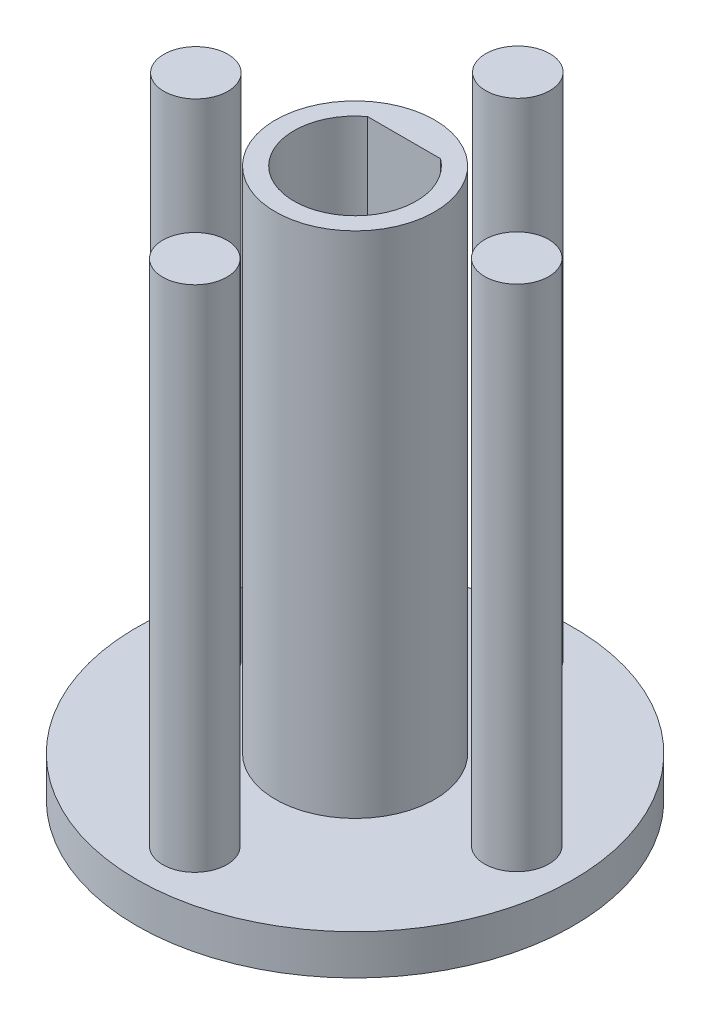
ISO-10303-21;
HEADER;
FILE_DESCRIPTION(('STEP AP214'),'2;1');
FILE_NAME('part.step','',(''),(''),'','','');
FILE_SCHEMA(('AUTOMOTIVE_DESIGN { 1 0 10303 214 1 1 1 1 }'));
ENDSEC;
DATA;
#1=APPLICATION_CONTEXT('core data for automotive mechanical design processes');
#2=APPLICATION_PROTOCOL_DEFINITION('international standard','automotive_design',2000,#1);
#3=PRODUCT_CONTEXT('',#1,'mechanical');
#4=PRODUCT('Part','Part','',(#3));
#5=PRODUCT_RELATED_PRODUCT_CATEGORY('part','',(#4));
#6=PRODUCT_DEFINITION_FORMATION('','',#4);
#7=PRODUCT_DEFINITION_CONTEXT('part definition',#1,'design');
#8=PRODUCT_DEFINITION('design','',#6,#7);
#9=PRODUCT_DEFINITION_SHAPE('','',#8);
#10=(LENGTH_UNIT() NAMED_UNIT(*) SI_UNIT(.MILLI.,.METRE.));
#11=(NAMED_UNIT(*) PLANE_ANGLE_UNIT() SI_UNIT($,.RADIAN.));
#12=(NAMED_UNIT(*) SI_UNIT($,.STERADIAN.) SOLID_ANGLE_UNIT());
#13=UNCERTAINTY_MEASURE_WITH_UNIT(LENGTH_MEASURE(1.E-05),#10,'distance_accuracy_value','');
#14=(GEOMETRIC_REPRESENTATION_CONTEXT(3) GLOBAL_UNCERTAINTY_ASSIGNED_CONTEXT((#13)) GLOBAL_UNIT_ASSIGNED_CONTEXT((#10,
#11,#12)) REPRESENTATION_CONTEXT('',''));
#15=CARTESIAN_POINT('',(0.,0.,0.));
#16=DIRECTION('',(0.,0.,1.));
#17=DIRECTION('',(1.,0.,0.));
#18=AXIS2_PLACEMENT_3D('',#15,#16,#17);
#19=CARTESIAN_POINT('',(0.,2.,0.));
#20=DIRECTION('',(0.,1.,0.));
#21=DIRECTION('',(0.,0.,1.));
#22=AXIS2_PLACEMENT_3D('',#19,#20,#21);
#23=PLANE('',#22);
#24=CARTESIAN_POINT('',(0.,2.,0.));
#25=DIRECTION('',(0.,1.,0.));
#26=DIRECTION('',(0.,0.,1.));
#27=AXIS2_PLACEMENT_3D('',#24,#25,#26);
#28=CIRCLE('',#27,10.9);
#29=CARTESIAN_POINT('',(0.,2.,10.9));
#30=VERTEX_POINT('',#29);
#31=EDGE_CURVE('E112',#30,#30,#28,.T.);
#32=ORIENTED_EDGE('',*,*,#31,.T.);
#33=EDGE_LOOP('',(#32));
#34=FACE_BOUND('',#33,.T.);
#35=CARTESIAN_POINT('',(-7.99946540436632,2.,-0.0531912101153402));
#36=DIRECTION('',(0.,1.,0.));
#37=DIRECTION('',(0.,0.,1.));
#38=AXIS2_PLACEMENT_3D('',#35,#36,#37);
#39=CIRCLE('',#38,1.6);
#40=CARTESIAN_POINT('',(-7.99946540436632,1.99999999999999,-1.65319121011534));
#41=VERTEX_POINT('',#40);
#42=EDGE_CURVE('E48',#41,#41,#39,.T.);
#43=ORIENTED_EDGE('',*,*,#42,.F.);
#44=EDGE_LOOP('',(#43));
#45=FACE_BOUND('',#44,.T.);
#46=CARTESIAN_POINT('',(0.0091799489627781,2.,8.00905715153994));
#47=DIRECTION('',(0.,1.,0.));
#48=DIRECTION('',(0.,0.,1.));
#49=AXIS2_PLACEMENT_3D('',#46,#47,#48);
#50=CIRCLE('',#49,1.6);
#51=CARTESIAN_POINT('',(0.0091799489627781,1.99999999999999,6.40905715153994));
#52=VERTEX_POINT('',#51);
#53=EDGE_CURVE('E108',#52,#52,#50,.F.);
#54=ORIENTED_EDGE('',*,*,#53,.T.);
#55=EDGE_LOOP('',(#54));
#56=FACE_BOUND('',#55,.T.);
#57=CARTESIAN_POINT('',(8.01767982733765,2.,-0.0533357152510716));
#58=DIRECTION('',(0.,1.,0.));
#59=DIRECTION('',(0.,0.,1.));
#60=AXIS2_PLACEMENT_3D('',#57,#58,#59);
#61=CIRCLE('',#60,1.6);
#62=CARTESIAN_POINT('',(8.01767982733765,1.99999999999999,-1.65333571525107));
#63=VERTEX_POINT('',#62);
#64=EDGE_CURVE('E102',#63,#63,#61,.F.);
#65=ORIENTED_EDGE('',*,*,#64,.T.);
#66=EDGE_LOOP('',(#65));
#67=FACE_BOUND('',#66,.T.);
#68=CARTESIAN_POINT('',(0.00903447400855788,2.,-8.11558407690636));
#69=DIRECTION('',(0.,1.,0.));
#70=DIRECTION('',(0.,0.,1.));
#71=AXIS2_PLACEMENT_3D('',#68,#69,#70);
#72=CIRCLE('',#71,1.6);
#73=CARTESIAN_POINT('',(0.00903447400855788,1.99999999999999,-9.71558407690635));
#74=VERTEX_POINT('',#73);
#75=EDGE_CURVE('E96',#74,#74,#72,.F.);
#76=ORIENTED_EDGE('',*,*,#75,.T.);
#77=EDGE_LOOP('',(#76));
#78=FACE_BOUND('',#77,.T.);
#79=CARTESIAN_POINT('',(0.,2.,0.));
#80=DIRECTION('',(0.,1.,0.));
#81=DIRECTION('',(0.,0.,1.));
#82=AXIS2_PLACEMENT_3D('',#79,#80,#81);
#83=CIRCLE('',#82,3.975);
#84=CARTESIAN_POINT('',(0.,1.99999999999999,-3.975));
#85=VERTEX_POINT('',#84);
#86=EDGE_CURVE('E90',#85,#85,#83,.F.);
#87=ORIENTED_EDGE('',*,*,#86,.T.);
#88=EDGE_LOOP('',(#87));
#89=FACE_BOUND('',#88,.T.);
#90=ADVANCED_FACE('F44',(#34,#45,#56,#67,#78,#89),#23,.T.);
#91=CARTESIAN_POINT('',(-7.99946540436632,27.4,-0.0531912101153402));
#92=DIRECTION('',(0.,-1.,0.));
#93=DIRECTION('',(0.,0.,-1.));
#94=AXIS2_PLACEMENT_3D('',#91,#92,#93);
#95=CYLINDRICAL_SURFACE('',#94,1.6);
#96=CARTESIAN_POINT('',(-7.99946540436632,27.4,-0.0531912101153402));
#97=DIRECTION('',(0.,1.,0.));
#98=DIRECTION('',(0.,0.,1.));
#99=AXIS2_PLACEMENT_3D('',#96,#97,#98);
#100=CIRCLE('',#99,1.6);
#101=CARTESIAN_POINT('',(-7.99946540436632,27.4,-1.65319121011534));
#102=VERTEX_POINT('',#101);
#103=EDGE_CURVE('E12',#102,#102,#100,.T.);
#104=CARTESIAN_POINT('',(-7.99946540436632,1.99999999999999,-1.65319121011534));
#105=CARTESIAN_POINT('',(-7.99946540436632,2.26458333333333,-1.65319121011534));
#106=CARTESIAN_POINT('',(-7.99946540436632,2.52916666666666,-1.65319121011534));
#107=CARTESIAN_POINT('',(-7.99946540436632,3.05833333333333,-1.65319121011534));
#108=CARTESIAN_POINT('',(-7.99946540436632,3.32291666666666,-1.65319121011534));
#109=CARTESIAN_POINT('',(-7.99946540436632,3.85208333333333,-1.65319121011534));
#110=CARTESIAN_POINT('',(-7.99946540436632,4.11666666666666,-1.65319121011534));
#111=CARTESIAN_POINT('',(-7.99946540436632,4.64583333333333,-1.65319121011534));
#112=CARTESIAN_POINT('',(-7.99946540436632,4.91041666666666,-1.65319121011534));
#113=CARTESIAN_POINT('',(-7.99946540436632,5.43958333333333,-1.65319121011534));
#114=CARTESIAN_POINT('',(-7.99946540436632,5.70416666666666,-1.65319121011534));
#115=CARTESIAN_POINT('',(-7.99946540436632,6.23333333333333,-1.65319121011534));
#116=CARTESIAN_POINT('',(-7.99946540436632,6.49791666666666,-1.65319121011534));
#117=CARTESIAN_POINT('',(-7.99946540436632,7.02708333333333,-1.65319121011534));
#118=CARTESIAN_POINT('',(-7.99946540436632,7.29166666666666,-1.65319121011534));
#119=CARTESIAN_POINT('',(-7.99946540436632,7.82083333333333,-1.65319121011534));
#120=CARTESIAN_POINT('',(-7.99946540436632,8.08541666666666,-1.65319121011534));
#121=CARTESIAN_POINT('',(-7.99946540436632,8.61458333333333,-1.65319121011534));
#122=CARTESIAN_POINT('',(-7.99946540436632,8.87916666666666,-1.65319121011534));
#123=CARTESIAN_POINT('',(-7.99946540436632,9.40833333333333,-1.65319121011534));
#124=CARTESIAN_POINT('',(-7.99946540436632,9.67291666666666,-1.65319121011534));
#125=CARTESIAN_POINT('',(-7.99946540436632,10.2020833333333,-1.65319121011534));
#126=CARTESIAN_POINT('',(-7.99946540436632,10.4666666666667,-1.65319121011534));
#127=CARTESIAN_POINT('',(-7.99946540436632,10.9958333333333,-1.65319121011534));
#128=CARTESIAN_POINT('',(-7.99946540436632,11.2604166666667,-1.65319121011534));
#129=CARTESIAN_POINT('',(-7.99946540436632,11.7895833333333,-1.65319121011534));
#130=CARTESIAN_POINT('',(-7.99946540436632,12.0541666666667,-1.65319121011534));
#131=CARTESIAN_POINT('',(-7.99946540436632,12.5833333333333,-1.65319121011534));
#132=CARTESIAN_POINT('',(-7.99946540436632,12.8479166666667,-1.65319121011534));
#133=CARTESIAN_POINT('',(-7.99946540436632,13.3770833333333,-1.65319121011534));
#134=CARTESIAN_POINT('',(-7.99946540436632,13.6416666666667,-1.65319121011534));
#135=CARTESIAN_POINT('',(-7.99946540436632,14.1708333333333,-1.65319121011534));
#136=CARTESIAN_POINT('',(-7.99946540436632,14.4354166666667,-1.65319121011534));
#137=CARTESIAN_POINT('',(-7.99946540436632,14.9645833333333,-1.65319121011534));
#138=CARTESIAN_POINT('',(-7.99946540436632,15.2291666666667,-1.65319121011534));
#139=CARTESIAN_POINT('',(-7.99946540436632,15.7583333333333,-1.65319121011534));
#140=CARTESIAN_POINT('',(-7.99946540436632,16.0229166666667,-1.65319121011534));
#141=CARTESIAN_POINT('',(-7.99946540436632,16.5520833333333,-1.65319121011534));
#142=CARTESIAN_POINT('',(-7.99946540436632,16.8166666666667,-1.65319121011534));
#143=CARTESIAN_POINT('',(-7.99946540436632,17.3458333333333,-1.65319121011534));
#144=CARTESIAN_POINT('',(-7.99946540436632,17.6104166666667,-1.65319121011534));
#145=CARTESIAN_POINT('',(-7.99946540436632,18.1395833333333,-1.65319121011534));
#146=CARTESIAN_POINT('',(-7.99946540436632,18.4041666666667,-1.65319121011534));
#147=CARTESIAN_POINT('',(-7.99946540436632,18.9333333333333,-1.65319121011534));
#148=CARTESIAN_POINT('',(-7.99946540436632,19.1979166666667,-1.65319121011534));
#149=CARTESIAN_POINT('',(-7.99946540436632,19.7270833333333,-1.65319121011534));
#150=CARTESIAN_POINT('',(-7.99946540436632,19.9916666666667,-1.65319121011534));
#151=CARTESIAN_POINT('',(-7.99946540436632,20.5208333333333,-1.65319121011534));
#152=CARTESIAN_POINT('',(-7.99946540436632,20.7854166666667,-1.65319121011534));
#153=CARTESIAN_POINT('',(-7.99946540436632,21.3145833333333,-1.65319121011534));
#154=CARTESIAN_POINT('',(-7.99946540436632,21.5791666666667,-1.65319121011534));
#155=CARTESIAN_POINT('',(-7.99946540436632,22.1083333333333,-1.65319121011534));
#156=CARTESIAN_POINT('',(-7.99946540436632,22.3729166666667,-1.65319121011534));
#157=CARTESIAN_POINT('',(-7.99946540436632,22.9020833333333,-1.65319121011534));
#158=CARTESIAN_POINT('',(-7.99946540436632,23.1666666666667,-1.65319121011534));
#159=CARTESIAN_POINT('',(-7.99946540436632,23.6958333333333,-1.65319121011534));
#160=CARTESIAN_POINT('',(-7.99946540436632,23.9604166666667,-1.65319121011534));
#161=CARTESIAN_POINT('',(-7.99946540436632,24.4895833333333,-1.65319121011534));
#162=CARTESIAN_POINT('',(-7.99946540436632,24.7541666666667,-1.65319121011534));
#163=CARTESIAN_POINT('',(-7.99946540436632,25.2833333333333,-1.65319121011534));
#164=CARTESIAN_POINT('',(-7.99946540436632,25.5479166666667,-1.65319121011534));
#165=CARTESIAN_POINT('',(-7.99946540436632,26.0770833333333,-1.65319121011534));
#166=CARTESIAN_POINT('',(-7.99946540436632,26.3416666666667,-1.65319121011534));
#167=CARTESIAN_POINT('',(-7.99946540436632,26.8708333333333,-1.65319121011534));
#168=CARTESIAN_POINT('',(-7.99946540436632,27.1354166666667,-1.65319121011534));
#169=CARTESIAN_POINT('',(-7.99946540436632,27.4,-1.65319121011534));
#170=B_SPLINE_CURVE_WITH_KNOTS('',3,(#104,#105,#106,#107,#108,#109,#110,#111,#112,#113,#114,
#115,#116,#117,#118,#119,#120,#121,#122,#123,#124,#125,#126,#127,#128,#129,#130,#131,#132,#133,
#134,#135,#136,#137,#138,#139,#140,#141,#142,#143,#144,#145,#146,#147,#148,#149,#150,#151,#152,
#153,#154,#155,#156,#157,#158,#159,#160,#161,#162,#163,#164,#165,#166,#167,#168,#169),
.UNSPECIFIED.,.F.,.F.,(4,2,2,2,2,2,2,2,2,2,2,2,2,2,2,2,2,2,2,2,2,2,2,2,2,2,2,2,2,2,2,2,4),(0.,
0.793749999999999,1.5875,2.38125,3.175,3.96875,4.7625,5.55625,6.35,7.14375,7.9375,8.73125,9.525,
10.31875,11.1125,11.90625,12.7,13.49375,14.2875,15.08125,15.875,16.66875,17.4625,18.25625,19.05,
19.84375,20.6375,21.43125,22.225,23.01875,23.8125,24.60625,25.4),.UNSPECIFIED.);
#171=EDGE_CURVE('BSEAM46',#41,#102,#170,.T.);
#172=ORIENTED_EDGE('',*,*,#42,.T.);
#173=ORIENTED_EDGE('',*,*,#103,.F.);
#174=ORIENTED_EDGE('',*,*,#171,.T.);
#175=ORIENTED_EDGE('',*,*,#171,.F.);
#176=EDGE_LOOP('',(#172,#174,#173,#175));
#177=FACE_BOUND('',#176,.T.);
#178=ADVANCED_FACE('F46',(#177),#95,.T.);
#179=CARTESIAN_POINT('',(-7.99946540436632,27.4,-0.0531912101153402));
#180=DIRECTION('',(0.,1.,0.));
#181=DIRECTION('',(0.,0.,1.));
#182=AXIS2_PLACEMENT_3D('',#179,#180,#181);
#183=PLANE('',#182);
#184=ORIENTED_EDGE('',*,*,#103,.T.);
#185=EDGE_LOOP('',(#184));
#186=FACE_BOUND('',#185,.T.);
#187=ADVANCED_FACE('F130',(#186),#183,.T.);
#188=CARTESIAN_POINT('',(0.,2.,0.));
#189=DIRECTION('',(0.,-1.,0.));
#190=DIRECTION('',(0.,0.,-1.));
#191=AXIS2_PLACEMENT_3D('',#188,#189,#190);
#192=CYLINDRICAL_SURFACE('',#191,10.9);
#193=ORIENTED_EDGE('',*,*,#31,.F.);
#194=EDGE_LOOP('',(#193));
#195=FACE_BOUND('',#194,.T.);
#196=CARTESIAN_POINT('',(0.,0.,0.));
#197=DIRECTION('',(0.,1.,0.));
#198=DIRECTION('',(0.,0.,1.));
#199=AXIS2_PLACEMENT_3D('',#196,#197,#198);
#200=CIRCLE('',#199,10.9);
#201=CARTESIAN_POINT('',(0.,0.,10.9));
#202=VERTEX_POINT('',#201);
#203=EDGE_CURVE('E111',#202,#202,#200,.T.);
#204=ORIENTED_EDGE('',*,*,#203,.T.);
#205=EDGE_LOOP('',(#204));
#206=FACE_BOUND('',#205,.T.);
#207=ADVANCED_FACE('F118',(#195,#206),#192,.T.);
#208=CARTESIAN_POINT('',(-7.99946540436632,0.,-0.0531912101153402));
#209=DIRECTION('',(0.,1.,0.));
#210=DIRECTION('',(0.,0.,1.));
#211=AXIS2_PLACEMENT_3D('',#208,#209,#210);
#212=PLANE('',#211);
#213=ORIENTED_EDGE('',*,*,#203,.F.);
#214=EDGE_LOOP('',(#213));
#215=FACE_BOUND('',#214,.T.);
#216=ADVANCED_FACE('F120',(#215),#212,.F.);
#217=CARTESIAN_POINT('',(0.0091799489627781,27.4,8.00905715153994));
#218=DIRECTION('',(0.,-1.,0.));
#219=DIRECTION('',(0.,0.,-1.));
#220=AXIS2_PLACEMENT_3D('',#217,#218,#219);
#221=CYLINDRICAL_SURFACE('',#220,1.6);
#222=CARTESIAN_POINT('',(0.0091799489627781,27.4,8.00905715153994));
#223=DIRECTION('',(0.,1.,0.));
#224=DIRECTION('',(0.,0.,1.));
#225=AXIS2_PLACEMENT_3D('',#222,#223,#224);
#226=CIRCLE('',#225,1.6);
#227=CARTESIAN_POINT('',(0.0091799489627781,27.4,6.40905715153994));
#228=VERTEX_POINT('',#227);
#229=EDGE_CURVE('E105',#228,#228,#226,.T.);
#230=CARTESIAN_POINT('',(0.0091799489627781,1.99999999999999,6.40905715153994));
#231=CARTESIAN_POINT('',(0.0091799489627781,2.26458333333333,6.40905715153994));
#232=CARTESIAN_POINT('',(0.0091799489627781,2.52916666666666,6.40905715153994));
#233=CARTESIAN_POINT('',(0.0091799489627781,3.05833333333333,6.40905715153994));
#234=CARTESIAN_POINT('',(0.0091799489627781,3.32291666666666,6.40905715153994));
#235=CARTESIAN_POINT('',(0.0091799489627781,3.85208333333333,6.40905715153994));
#236=CARTESIAN_POINT('',(0.0091799489627781,4.11666666666666,6.40905715153994));
#237=CARTESIAN_POINT('',(0.0091799489627781,4.64583333333333,6.40905715153994));
#238=CARTESIAN_POINT('',(0.0091799489627781,4.91041666666666,6.40905715153994));
#239=CARTESIAN_POINT('',(0.0091799489627781,5.43958333333333,6.40905715153994));
#240=CARTESIAN_POINT('',(0.0091799489627781,5.70416666666666,6.40905715153994));
#241=CARTESIAN_POINT('',(0.0091799489627781,6.23333333333333,6.40905715153994));
#242=CARTESIAN_POINT('',(0.0091799489627781,6.49791666666666,6.40905715153994));
#243=CARTESIAN_POINT('',(0.0091799489627781,7.02708333333333,6.40905715153994));
#244=CARTESIAN_POINT('',(0.0091799489627781,7.29166666666666,6.40905715153994));
#245=CARTESIAN_POINT('',(0.0091799489627781,7.82083333333333,6.40905715153994));
#246=CARTESIAN_POINT('',(0.0091799489627781,8.08541666666666,6.40905715153994));
#247=CARTESIAN_POINT('',(0.0091799489627781,8.61458333333333,6.40905715153994));
#248=CARTESIAN_POINT('',(0.0091799489627781,8.87916666666666,6.40905715153994));
#249=CARTESIAN_POINT('',(0.0091799489627781,9.40833333333333,6.40905715153994));
#250=CARTESIAN_POINT('',(0.0091799489627781,9.67291666666666,6.40905715153994));
#251=CARTESIAN_POINT('',(0.0091799489627781,10.2020833333333,6.40905715153994));
#252=CARTESIAN_POINT('',(0.0091799489627781,10.4666666666667,6.40905715153994));
#253=CARTESIAN_POINT('',(0.0091799489627781,10.9958333333333,6.40905715153994));
#254=CARTESIAN_POINT('',(0.0091799489627781,11.2604166666667,6.40905715153994));
#255=CARTESIAN_POINT('',(0.0091799489627781,11.7895833333333,6.40905715153994));
#256=CARTESIAN_POINT('',(0.0091799489627781,12.0541666666667,6.40905715153994));
#257=CARTESIAN_POINT('',(0.0091799489627781,12.5833333333333,6.40905715153994));
#258=CARTESIAN_POINT('',(0.0091799489627781,12.8479166666667,6.40905715153994));
#259=CARTESIAN_POINT('',(0.0091799489627781,13.3770833333333,6.40905715153994));
#260=CARTESIAN_POINT('',(0.0091799489627781,13.6416666666667,6.40905715153994));
#261=CARTESIAN_POINT('',(0.0091799489627781,14.1708333333333,6.40905715153994));
#262=CARTESIAN_POINT('',(0.0091799489627781,14.4354166666667,6.40905715153994));
#263=CARTESIAN_POINT('',(0.0091799489627781,14.9645833333333,6.40905715153994));
#264=CARTESIAN_POINT('',(0.0091799489627781,15.2291666666667,6.40905715153994));
#265=CARTESIAN_POINT('',(0.0091799489627781,15.7583333333333,6.40905715153994));
#266=CARTESIAN_POINT('',(0.0091799489627781,16.0229166666667,6.40905715153994));
#267=CARTESIAN_POINT('',(0.0091799489627781,16.5520833333333,6.40905715153994));
#268=CARTESIAN_POINT('',(0.0091799489627781,16.8166666666667,6.40905715153994));
#269=CARTESIAN_POINT('',(0.0091799489627781,17.3458333333333,6.40905715153994));
#270=CARTESIAN_POINT('',(0.0091799489627781,17.6104166666667,6.40905715153994));
#271=CARTESIAN_POINT('',(0.0091799489627781,18.1395833333333,6.40905715153994));
#272=CARTESIAN_POINT('',(0.0091799489627781,18.4041666666667,6.40905715153994));
#273=CARTESIAN_POINT('',(0.0091799489627781,18.9333333333333,6.40905715153994));
#274=CARTESIAN_POINT('',(0.0091799489627781,19.1979166666667,6.40905715153994));
#275=CARTESIAN_POINT('',(0.0091799489627781,19.7270833333333,6.40905715153994));
#276=CARTESIAN_POINT('',(0.0091799489627781,19.9916666666667,6.40905715153994));
#277=CARTESIAN_POINT('',(0.0091799489627781,20.5208333333333,6.40905715153994));
#278=CARTESIAN_POINT('',(0.0091799489627781,20.7854166666667,6.40905715153994));
#279=CARTESIAN_POINT('',(0.0091799489627781,21.3145833333333,6.40905715153994));
#280=CARTESIAN_POINT('',(0.0091799489627781,21.5791666666667,6.40905715153994));
#281=CARTESIAN_POINT('',(0.0091799489627781,22.1083333333333,6.40905715153994));
#282=CARTESIAN_POINT('',(0.0091799489627781,22.3729166666667,6.40905715153994));
#283=CARTESIAN_POINT('',(0.0091799489627781,22.9020833333333,6.40905715153994));
#284=CARTESIAN_POINT('',(0.0091799489627781,23.1666666666667,6.40905715153994));
#285=CARTESIAN_POINT('',(0.0091799489627781,23.6958333333333,6.40905715153994));
#286=CARTESIAN_POINT('',(0.0091799489627781,23.9604166666667,6.40905715153994));
#287=CARTESIAN_POINT('',(0.0091799489627781,24.4895833333333,6.40905715153994));
#288=CARTESIAN_POINT('',(0.0091799489627781,24.7541666666667,6.40905715153994));
#289=CARTESIAN_POINT('',(0.0091799489627781,25.2833333333333,6.40905715153994));
#290=CARTESIAN_POINT('',(0.0091799489627781,25.5479166666667,6.40905715153994));
#291=CARTESIAN_POINT('',(0.0091799489627781,26.0770833333333,6.40905715153994));
#292=CARTESIAN_POINT('',(0.0091799489627781,26.3416666666667,6.40905715153994));
#293=CARTESIAN_POINT('',(0.0091799489627781,26.8708333333333,6.40905715153994));
#294=CARTESIAN_POINT('',(0.0091799489627781,27.1354166666667,6.40905715153994));
#295=CARTESIAN_POINT('',(0.0091799489627781,27.4,6.40905715153994));
#296=B_SPLINE_CURVE_WITH_KNOTS('',3,(#230,#231,#232,#233,#234,#235,#236,#237,#238,#239,#240,
#241,#242,#243,#244,#245,#246,#247,#248,#249,#250,#251,#252,#253,#254,#255,#256,#257,#258,#259,
#260,#261,#262,#263,#264,#265,#266,#267,#268,#269,#270,#271,#272,#273,#274,#275,#276,#277,#278,
#279,#280,#281,#282,#283,#284,#285,#286,#287,#288,#289,#290,#291,#292,#293,#294,#295),
.UNSPECIFIED.,.F.,.F.,(4,2,2,2,2,2,2,2,2,2,2,2,2,2,2,2,2,2,2,2,2,2,2,2,2,2,2,2,2,2,2,2,4),(0.,
0.793749999999999,1.5875,2.38125,3.175,3.96875,4.7625,5.55625,6.35,7.14375,7.9375,8.73125,9.525,
10.31875,11.1125,11.90625,12.7,13.49375,14.2875,15.08125,15.875,16.66875,17.4625,18.25625,19.05,
19.84375,20.6375,21.43125,22.225,23.01875,23.8125,24.60625,25.4),.UNSPECIFIED.);
#297=EDGE_CURVE('BSEAM122',#52,#228,#296,.T.);
#298=ORIENTED_EDGE('',*,*,#53,.F.);
#299=ORIENTED_EDGE('',*,*,#229,.F.);
#300=ORIENTED_EDGE('',*,*,#297,.T.);
#301=ORIENTED_EDGE('',*,*,#297,.F.);
#302=EDGE_LOOP('',(#298,#300,#299,#301));
#303=FACE_BOUND('',#302,.T.);
#304=ADVANCED_FACE('F122',(#303),#221,.T.);
#305=CARTESIAN_POINT('',(0.0091799489627781,27.4,8.00905715153994));
#306=DIRECTION('',(0.,1.,0.));
#307=DIRECTION('',(0.,0.,1.));
#308=AXIS2_PLACEMENT_3D('',#305,#306,#307);
#309=PLANE('',#308);
#310=ORIENTED_EDGE('',*,*,#229,.T.);
#311=EDGE_LOOP('',(#310));
#312=FACE_BOUND('',#311,.T.);
#313=ADVANCED_FACE('F127',(#312),#309,.T.);
#314=CARTESIAN_POINT('',(8.01767982733765,27.4,-0.0533357152510716));
#315=DIRECTION('',(0.,-1.,0.));
#316=DIRECTION('',(0.,0.,-1.));
#317=AXIS2_PLACEMENT_3D('',#314,#315,#316);
#318=CYLINDRICAL_SURFACE('',#317,1.6);
#319=CARTESIAN_POINT('',(8.01767982733765,27.4,-0.0533357152510716));
#320=DIRECTION('',(0.,1.,0.));
#321=DIRECTION('',(0.,0.,1.));
#322=AXIS2_PLACEMENT_3D('',#319,#320,#321);
#323=CIRCLE('',#322,1.6);
#324=CARTESIAN_POINT('',(8.01767982733765,27.4,-1.65333571525107));
#325=VERTEX_POINT('',#324);
#326=EDGE_CURVE('E99',#325,#325,#323,.T.);
#327=CARTESIAN_POINT('',(8.01767982733765,1.99999999999999,-1.65333571525107));
#328=CARTESIAN_POINT('',(8.01767982733765,2.26458333333333,-1.65333571525107));
#329=CARTESIAN_POINT('',(8.01767982733765,2.52916666666666,-1.65333571525107));
#330=CARTESIAN_POINT('',(8.01767982733765,3.05833333333333,-1.65333571525107));
#331=CARTESIAN_POINT('',(8.01767982733765,3.32291666666666,-1.65333571525107));
#332=CARTESIAN_POINT('',(8.01767982733765,3.85208333333333,-1.65333571525107));
#333=CARTESIAN_POINT('',(8.01767982733765,4.11666666666666,-1.65333571525107));
#334=CARTESIAN_POINT('',(8.01767982733765,4.64583333333333,-1.65333571525107));
#335=CARTESIAN_POINT('',(8.01767982733765,4.91041666666666,-1.65333571525107));
#336=CARTESIAN_POINT('',(8.01767982733765,5.43958333333333,-1.65333571525107));
#337=CARTESIAN_POINT('',(8.01767982733765,5.70416666666666,-1.65333571525107));
#338=CARTESIAN_POINT('',(8.01767982733765,6.23333333333333,-1.65333571525107));
#339=CARTESIAN_POINT('',(8.01767982733765,6.49791666666666,-1.65333571525107));
#340=CARTESIAN_POINT('',(8.01767982733765,7.02708333333333,-1.65333571525107));
#341=CARTESIAN_POINT('',(8.01767982733765,7.29166666666666,-1.65333571525107));
#342=CARTESIAN_POINT('',(8.01767982733765,7.82083333333333,-1.65333571525107));
#343=CARTESIAN_POINT('',(8.01767982733765,8.08541666666666,-1.65333571525107));
#344=CARTESIAN_POINT('',(8.01767982733765,8.61458333333333,-1.65333571525107));
#345=CARTESIAN_POINT('',(8.01767982733765,8.87916666666666,-1.65333571525107));
#346=CARTESIAN_POINT('',(8.01767982733765,9.40833333333333,-1.65333571525107));
#347=CARTESIAN_POINT('',(8.01767982733765,9.67291666666666,-1.65333571525107));
#348=CARTESIAN_POINT('',(8.01767982733765,10.2020833333333,-1.65333571525107));
#349=CARTESIAN_POINT('',(8.01767982733765,10.4666666666667,-1.65333571525107));
#350=CARTESIAN_POINT('',(8.01767982733765,10.9958333333333,-1.65333571525107));
#351=CARTESIAN_POINT('',(8.01767982733765,11.2604166666667,-1.65333571525107));
#352=CARTESIAN_POINT('',(8.01767982733765,11.7895833333333,-1.65333571525107));
#353=CARTESIAN_POINT('',(8.01767982733765,12.0541666666667,-1.65333571525107));
#354=CARTESIAN_POINT('',(8.01767982733765,12.5833333333333,-1.65333571525107));
#355=CARTESIAN_POINT('',(8.01767982733765,12.8479166666667,-1.65333571525107));
#356=CARTESIAN_POINT('',(8.01767982733765,13.3770833333333,-1.65333571525107));
#357=CARTESIAN_POINT('',(8.01767982733765,13.6416666666667,-1.65333571525107));
#358=CARTESIAN_POINT('',(8.01767982733765,14.1708333333333,-1.65333571525107));
#359=CARTESIAN_POINT('',(8.01767982733765,14.4354166666667,-1.65333571525107));
#360=CARTESIAN_POINT('',(8.01767982733765,14.9645833333333,-1.65333571525107));
#361=CARTESIAN_POINT('',(8.01767982733765,15.2291666666667,-1.65333571525107));
#362=CARTESIAN_POINT('',(8.01767982733765,15.7583333333333,-1.65333571525107));
#363=CARTESIAN_POINT('',(8.01767982733765,16.0229166666667,-1.65333571525107));
#364=CARTESIAN_POINT('',(8.01767982733765,16.5520833333333,-1.65333571525107));
#365=CARTESIAN_POINT('',(8.01767982733765,16.8166666666667,-1.65333571525107));
#366=CARTESIAN_POINT('',(8.01767982733765,17.3458333333333,-1.65333571525107));
#367=CARTESIAN_POINT('',(8.01767982733765,17.6104166666667,-1.65333571525107));
#368=CARTESIAN_POINT('',(8.01767982733765,18.1395833333333,-1.65333571525107));
#369=CARTESIAN_POINT('',(8.01767982733765,18.4041666666667,-1.65333571525107));
#370=CARTESIAN_POINT('',(8.01767982733765,18.9333333333333,-1.65333571525107));
#371=CARTESIAN_POINT('',(8.01767982733765,19.1979166666667,-1.65333571525107));
#372=CARTESIAN_POINT('',(8.01767982733765,19.7270833333333,-1.65333571525107));
#373=CARTESIAN_POINT('',(8.01767982733765,19.9916666666667,-1.65333571525107));
#374=CARTESIAN_POINT('',(8.01767982733765,20.5208333333333,-1.65333571525107));
#375=CARTESIAN_POINT('',(8.01767982733765,20.7854166666667,-1.65333571525107));
#376=CARTESIAN_POINT('',(8.01767982733765,21.3145833333333,-1.65333571525107));
#377=CARTESIAN_POINT('',(8.01767982733765,21.5791666666667,-1.65333571525107));
#378=CARTESIAN_POINT('',(8.01767982733765,22.1083333333333,-1.65333571525107));
#379=CARTESIAN_POINT('',(8.01767982733765,22.3729166666667,-1.65333571525107));
#380=CARTESIAN_POINT('',(8.01767982733765,22.9020833333333,-1.65333571525107));
#381=CARTESIAN_POINT('',(8.01767982733765,23.1666666666667,-1.65333571525107));
#382=CARTESIAN_POINT('',(8.01767982733765,23.6958333333333,-1.65333571525107));
#383=CARTESIAN_POINT('',(8.01767982733765,23.9604166666667,-1.65333571525107));
#384=CARTESIAN_POINT('',(8.01767982733765,24.4895833333333,-1.65333571525107));
#385=CARTESIAN_POINT('',(8.01767982733765,24.7541666666667,-1.65333571525107));
#386=CARTESIAN_POINT('',(8.01767982733765,25.2833333333333,-1.65333571525107));
#387=CARTESIAN_POINT('',(8.01767982733765,25.5479166666667,-1.65333571525107));
#388=CARTESIAN_POINT('',(8.01767982733765,26.0770833333333,-1.65333571525107));
#389=CARTESIAN_POINT('',(8.01767982733765,26.3416666666667,-1.65333571525107));
#390=CARTESIAN_POINT('',(8.01767982733765,26.8708333333333,-1.65333571525107));
#391=CARTESIAN_POINT('',(8.01767982733765,27.1354166666667,-1.65333571525107));
#392=CARTESIAN_POINT('',(8.01767982733765,27.4,-1.65333571525107));
#393=B_SPLINE_CURVE_WITH_KNOTS('',3,(#327,#328,#329,#330,#331,#332,#333,#334,#335,#336,#337,
#338,#339,#340,#341,#342,#343,#344,#345,#346,#347,#348,#349,#350,#351,#352,#353,#354,#355,#356,
#357,#358,#359,#360,#361,#362,#363,#364,#365,#366,#367,#368,#369,#370,#371,#372,#373,#374,#375,
#376,#377,#378,#379,#380,#381,#382,#383,#384,#385,#386,#387,#388,#389,#390,#391,#392),
.UNSPECIFIED.,.F.,.F.,(4,2,2,2,2,2,2,2,2,2,2,2,2,2,2,2,2,2,2,2,2,2,2,2,2,2,2,2,2,2,2,2,4),(0.,
0.793749999999999,1.5875,2.38125,3.175,3.96875,4.7625,5.55625,6.35,7.14375,7.9375,8.73125,9.525,
10.31875,11.1125,11.90625,12.7,13.49375,14.2875,15.08125,15.875,16.66875,17.4625,18.25625,19.05,
19.84375,20.6375,21.43125,22.225,23.01875,23.8125,24.60625,25.4),.UNSPECIFIED.);
#394=EDGE_CURVE('BSEAM166',#63,#325,#393,.T.);
#395=ORIENTED_EDGE('',*,*,#64,.F.);
#396=ORIENTED_EDGE('',*,*,#326,.F.);
#397=ORIENTED_EDGE('',*,*,#394,.T.);
#398=ORIENTED_EDGE('',*,*,#394,.F.);
#399=EDGE_LOOP('',(#395,#397,#396,#398));
#400=FACE_BOUND('',#399,.T.);
#401=ADVANCED_FACE('F166',(#400),#318,.T.);
#402=CARTESIAN_POINT('',(8.01767982733765,27.4,-0.0533357152510716));
#403=DIRECTION('',(0.,1.,0.));
#404=DIRECTION('',(0.,0.,1.));
#405=AXIS2_PLACEMENT_3D('',#402,#403,#404);
#406=PLANE('',#405);
#407=ORIENTED_EDGE('',*,*,#326,.T.);
#408=EDGE_LOOP('',(#407));
#409=FACE_BOUND('',#408,.T.);
#410=ADVANCED_FACE('F161',(#409),#406,.T.);
#411=CARTESIAN_POINT('',(0.00903447400855788,27.4,-8.11558407690636));
#412=DIRECTION('',(0.,-1.,0.));
#413=DIRECTION('',(0.,0.,-1.));
#414=AXIS2_PLACEMENT_3D('',#411,#412,#413);
#415=CYLINDRICAL_SURFACE('',#414,1.6);
#416=CARTESIAN_POINT('',(0.00903447400855788,27.4,-8.11558407690636));
#417=DIRECTION('',(0.,1.,0.));
#418=DIRECTION('',(0.,0.,1.));
#419=AXIS2_PLACEMENT_3D('',#416,#417,#418);
#420=CIRCLE('',#419,1.6);
#421=CARTESIAN_POINT('',(0.00903447400855788,27.4,-9.71558407690635));
#422=VERTEX_POINT('',#421);
#423=EDGE_CURVE('E93',#422,#422,#420,.T.);
#424=CARTESIAN_POINT('',(0.00903447400855788,1.99999999999999,-9.71558407690635));
#425=CARTESIAN_POINT('',(0.00903447400855788,2.26458333333333,-9.71558407690635));
#426=CARTESIAN_POINT('',(0.00903447400855788,2.52916666666666,-9.71558407690635));
#427=CARTESIAN_POINT('',(0.00903447400855788,3.05833333333333,-9.71558407690635));
#428=CARTESIAN_POINT('',(0.00903447400855788,3.32291666666666,-9.71558407690635));
#429=CARTESIAN_POINT('',(0.00903447400855788,3.85208333333333,-9.71558407690635));
#430=CARTESIAN_POINT('',(0.00903447400855788,4.11666666666666,-9.71558407690635));
#431=CARTESIAN_POINT('',(0.00903447400855788,4.64583333333333,-9.71558407690635));
#432=CARTESIAN_POINT('',(0.00903447400855788,4.91041666666666,-9.71558407690635));
#433=CARTESIAN_POINT('',(0.00903447400855788,5.43958333333333,-9.71558407690635));
#434=CARTESIAN_POINT('',(0.00903447400855788,5.70416666666666,-9.71558407690635));
#435=CARTESIAN_POINT('',(0.00903447400855788,6.23333333333333,-9.71558407690635));
#436=CARTESIAN_POINT('',(0.00903447400855788,6.49791666666666,-9.71558407690635));
#437=CARTESIAN_POINT('',(0.00903447400855788,7.02708333333333,-9.71558407690635));
#438=CARTESIAN_POINT('',(0.00903447400855788,7.29166666666666,-9.71558407690635));
#439=CARTESIAN_POINT('',(0.00903447400855788,7.82083333333333,-9.71558407690635));
#440=CARTESIAN_POINT('',(0.00903447400855788,8.08541666666666,-9.71558407690635));
#441=CARTESIAN_POINT('',(0.00903447400855788,8.61458333333333,-9.71558407690635));
#442=CARTESIAN_POINT('',(0.00903447400855788,8.87916666666666,-9.71558407690635));
#443=CARTESIAN_POINT('',(0.00903447400855788,9.40833333333333,-9.71558407690635));
#444=CARTESIAN_POINT('',(0.00903447400855788,9.67291666666666,-9.71558407690635));
#445=CARTESIAN_POINT('',(0.00903447400855788,10.2020833333333,-9.71558407690635));
#446=CARTESIAN_POINT('',(0.00903447400855788,10.4666666666667,-9.71558407690635));
#447=CARTESIAN_POINT('',(0.00903447400855788,10.9958333333333,-9.71558407690635));
#448=CARTESIAN_POINT('',(0.00903447400855788,11.2604166666667,-9.71558407690635));
#449=CARTESIAN_POINT('',(0.00903447400855788,11.7895833333333,-9.71558407690635));
#450=CARTESIAN_POINT('',(0.00903447400855788,12.0541666666667,-9.71558407690635));
#451=CARTESIAN_POINT('',(0.00903447400855788,12.5833333333333,-9.71558407690635));
#452=CARTESIAN_POINT('',(0.00903447400855788,12.8479166666667,-9.71558407690635));
#453=CARTESIAN_POINT('',(0.00903447400855788,13.3770833333333,-9.71558407690635));
#454=CARTESIAN_POINT('',(0.00903447400855788,13.6416666666667,-9.71558407690635));
#455=CARTESIAN_POINT('',(0.00903447400855788,14.1708333333333,-9.71558407690635));
#456=CARTESIAN_POINT('',(0.00903447400855788,14.4354166666667,-9.71558407690635));
#457=CARTESIAN_POINT('',(0.00903447400855788,14.9645833333333,-9.71558407690635));
#458=CARTESIAN_POINT('',(0.00903447400855788,15.2291666666667,-9.71558407690635));
#459=CARTESIAN_POINT('',(0.00903447400855788,15.7583333333333,-9.71558407690635));
#460=CARTESIAN_POINT('',(0.00903447400855788,16.0229166666667,-9.71558407690635));
#461=CARTESIAN_POINT('',(0.00903447400855788,16.5520833333333,-9.71558407690635));
#462=CARTESIAN_POINT('',(0.00903447400855788,16.8166666666667,-9.71558407690635));
#463=CARTESIAN_POINT('',(0.00903447400855788,17.3458333333333,-9.71558407690635));
#464=CARTESIAN_POINT('',(0.00903447400855788,17.6104166666667,-9.71558407690635));
#465=CARTESIAN_POINT('',(0.00903447400855788,18.1395833333333,-9.71558407690635));
#466=CARTESIAN_POINT('',(0.00903447400855788,18.4041666666667,-9.71558407690635));
#467=CARTESIAN_POINT('',(0.00903447400855788,18.9333333333333,-9.71558407690635));
#468=CARTESIAN_POINT('',(0.00903447400855788,19.1979166666667,-9.71558407690635));
#469=CARTESIAN_POINT('',(0.00903447400855788,19.7270833333333,-9.71558407690635));
#470=CARTESIAN_POINT('',(0.00903447400855788,19.9916666666667,-9.71558407690635));
#471=CARTESIAN_POINT('',(0.00903447400855788,20.5208333333333,-9.71558407690635));
#472=CARTESIAN_POINT('',(0.00903447400855788,20.7854166666667,-9.71558407690635));
#473=CARTESIAN_POINT('',(0.00903447400855788,21.3145833333333,-9.71558407690635));
#474=CARTESIAN_POINT('',(0.00903447400855788,21.5791666666667,-9.71558407690635));
#475=CARTESIAN_POINT('',(0.00903447400855788,22.1083333333333,-9.71558407690635));
#476=CARTESIAN_POINT('',(0.00903447400855788,22.3729166666667,-9.71558407690635));
#477=CARTESIAN_POINT('',(0.00903447400855788,22.9020833333333,-9.71558407690635));
#478=CARTESIAN_POINT('',(0.00903447400855788,23.1666666666667,-9.71558407690635));
#479=CARTESIAN_POINT('',(0.00903447400855788,23.6958333333333,-9.71558407690635));
#480=CARTESIAN_POINT('',(0.00903447400855788,23.9604166666667,-9.71558407690635));
#481=CARTESIAN_POINT('',(0.00903447400855788,24.4895833333333,-9.71558407690635));
#482=CARTESIAN_POINT('',(0.00903447400855788,24.7541666666667,-9.71558407690635));
#483=CARTESIAN_POINT('',(0.00903447400855788,25.2833333333333,-9.71558407690635));
#484=CARTESIAN_POINT('',(0.00903447400855788,25.5479166666667,-9.71558407690635));
#485=CARTESIAN_POINT('',(0.00903447400855788,26.0770833333333,-9.71558407690635));
#486=CARTESIAN_POINT('',(0.00903447400855788,26.3416666666667,-9.71558407690635));
#487=CARTESIAN_POINT('',(0.00903447400855788,26.8708333333333,-9.71558407690635));
#488=CARTESIAN_POINT('',(0.00903447400855788,27.1354166666667,-9.71558407690635));
#489=CARTESIAN_POINT('',(0.00903447400855788,27.4,-9.71558407690635));
#490=B_SPLINE_CURVE_WITH_KNOTS('',3,(#424,#425,#426,#427,#428,#429,#430,#431,#432,#433,#434,
#435,#436,#437,#438,#439,#440,#441,#442,#443,#444,#445,#446,#447,#448,#449,#450,#451,#452,#453,
#454,#455,#456,#457,#458,#459,#460,#461,#462,#463,#464,#465,#466,#467,#468,#469,#470,#471,#472,
#473,#474,#475,#476,#477,#478,#479,#480,#481,#482,#483,#484,#485,#486,#487,#488,#489),
.UNSPECIFIED.,.F.,.F.,(4,2,2,2,2,2,2,2,2,2,2,2,2,2,2,2,2,2,2,2,2,2,2,2,2,2,2,2,2,2,2,2,4),(0.,
0.793749999999999,1.5875,2.38125,3.175,3.96875,4.7625,5.55625,6.35,7.14375,7.9375,8.73125,9.525,
10.31875,11.1125,11.90625,12.7,13.49375,14.2875,15.08125,15.875,16.66875,17.4625,18.25625,19.05,
19.84375,20.6375,21.43125,22.225,23.01875,23.8125,24.60625,25.4),.UNSPECIFIED.);
#491=EDGE_CURVE('BSEAM157',#74,#422,#490,.T.);
#492=ORIENTED_EDGE('',*,*,#75,.F.);
#493=ORIENTED_EDGE('',*,*,#423,.F.);
#494=ORIENTED_EDGE('',*,*,#491,.T.);
#495=ORIENTED_EDGE('',*,*,#491,.F.);
#496=EDGE_LOOP('',(#492,#494,#493,#495));
#497=FACE_BOUND('',#496,.T.);
#498=ADVANCED_FACE('F157',(#497),#415,.T.);
#499=CARTESIAN_POINT('',(0.00903447400855788,27.4,-8.11558407690636));
#500=DIRECTION('',(0.,1.,0.));
#501=DIRECTION('',(0.,0.,1.));
#502=AXIS2_PLACEMENT_3D('',#499,#500,#501);
#503=PLANE('',#502);
#504=ORIENTED_EDGE('',*,*,#423,.T.);
#505=EDGE_LOOP('',(#504));
#506=FACE_BOUND('',#505,.T.);
#507=ADVANCED_FACE('F160',(#506),#503,.T.);
#508=CARTESIAN_POINT('',(0.,27.4,0.));
#509=DIRECTION('',(0.,1.,0.));
#510=DIRECTION('',(0.,0.,1.));
#511=AXIS2_PLACEMENT_3D('',#508,#509,#510);
#512=PLANE('',#511);
#513=CARTESIAN_POINT('',(0.,27.4,0.));
#514=DIRECTION('',(0.,1.,0.));
#515=DIRECTION('',(0.,0.,1.));
#516=AXIS2_PLACEMENT_3D('',#513,#514,#515);
#517=CIRCLE('',#516,3.975);
#518=CARTESIAN_POINT('',(0.,27.4,-3.975));
#519=VERTEX_POINT('',#518);
#520=EDGE_CURVE('E77',#519,#519,#517,.T.);
#521=ORIENTED_EDGE('',*,*,#520,.T.);
#522=EDGE_LOOP('',(#521));
#523=FACE_BOUND('',#522,.T.);
#524=DIRECTION('',(1.,0.,0.));
#525=VECTOR('',#524,1.);
#526=CARTESIAN_POINT('',(-1.82309834328727,27.4,-2.4451610234713));
#527=LINE('',#526,#525);
#528=CARTESIAN_POINT('',(-1.82309834328727,27.4,-2.4451610234713));
#529=VERTEX_POINT('',#528);
#530=CARTESIAN_POINT('',(1.82309834328727,27.4,-2.4451610234713));
#531=VERTEX_POINT('',#530);
#532=EDGE_CURVE('E73',#529,#531,#527,.T.);
#533=ORIENTED_EDGE('',*,*,#532,.T.);
#534=CARTESIAN_POINT('',(0.,27.4,0.));
#535=DIRECTION('',(0.,1.,0.));
#536=DIRECTION('',(0.,0.,1.));
#537=AXIS2_PLACEMENT_3D('',#534,#535,#536);
#538=CIRCLE('',#537,3.05);
#539=EDGE_CURVE('E79',#529,#531,#538,.T.);
#540=ORIENTED_EDGE('',*,*,#539,.F.);
#541=EDGE_LOOP('',(#533,#540));
#542=FACE_BOUND('',#541,.T.);
#543=ADVANCED_FACE('F83',(#523,#542),#512,.T.);
#544=CARTESIAN_POINT('',(0.,27.4,0.));
#545=DIRECTION('',(0.,-1.,0.));
#546=DIRECTION('',(0.,0.,-1.));
#547=AXIS2_PLACEMENT_3D('',#544,#545,#546);
#548=CYLINDRICAL_SURFACE('',#547,3.975);
#549=CARTESIAN_POINT('',(0.,1.99999999999999,-3.975));
#550=CARTESIAN_POINT('',(0.,2.26458333333333,-3.975));
#551=CARTESIAN_POINT('',(0.,2.52916666666666,-3.975));
#552=CARTESIAN_POINT('',(0.,3.05833333333333,-3.975));
#553=CARTESIAN_POINT('',(0.,3.32291666666666,-3.975));
#554=CARTESIAN_POINT('',(0.,3.85208333333333,-3.975));
#555=CARTESIAN_POINT('',(0.,4.11666666666666,-3.975));
#556=CARTESIAN_POINT('',(0.,4.64583333333333,-3.975));
#557=CARTESIAN_POINT('',(0.,4.91041666666666,-3.975));
#558=CARTESIAN_POINT('',(0.,5.43958333333333,-3.975));
#559=CARTESIAN_POINT('',(0.,5.70416666666666,-3.975));
#560=CARTESIAN_POINT('',(0.,6.23333333333333,-3.975));
#561=CARTESIAN_POINT('',(0.,6.49791666666666,-3.975));
#562=CARTESIAN_POINT('',(0.,7.02708333333333,-3.975));
#563=CARTESIAN_POINT('',(0.,7.29166666666666,-3.975));
#564=CARTESIAN_POINT('',(0.,7.82083333333333,-3.975));
#565=CARTESIAN_POINT('',(0.,8.08541666666666,-3.975));
#566=CARTESIAN_POINT('',(0.,8.61458333333333,-3.975));
#567=CARTESIAN_POINT('',(0.,8.87916666666666,-3.975));
#568=CARTESIAN_POINT('',(0.,9.40833333333333,-3.975));
#569=CARTESIAN_POINT('',(0.,9.67291666666666,-3.975));
#570=CARTESIAN_POINT('',(0.,10.2020833333333,-3.975));
#571=CARTESIAN_POINT('',(0.,10.4666666666667,-3.975));
#572=CARTESIAN_POINT('',(0.,10.9958333333333,-3.975));
#573=CARTESIAN_POINT('',(0.,11.2604166666667,-3.975));
#574=CARTESIAN_POINT('',(0.,11.7895833333333,-3.975));
#575=CARTESIAN_POINT('',(0.,12.0541666666667,-3.975));
#576=CARTESIAN_POINT('',(0.,12.5833333333333,-3.975));
#577=CARTESIAN_POINT('',(0.,12.8479166666667,-3.975));
#578=CARTESIAN_POINT('',(0.,13.3770833333333,-3.975));
#579=CARTESIAN_POINT('',(0.,13.6416666666667,-3.975));
#580=CARTESIAN_POINT('',(0.,14.1708333333333,-3.975));
#581=CARTESIAN_POINT('',(0.,14.4354166666667,-3.975));
#582=CARTESIAN_POINT('',(0.,14.9645833333333,-3.975));
#583=CARTESIAN_POINT('',(0.,15.2291666666667,-3.975));
#584=CARTESIAN_POINT('',(0.,15.7583333333333,-3.975));
#585=CARTESIAN_POINT('',(0.,16.0229166666667,-3.975));
#586=CARTESIAN_POINT('',(0.,16.5520833333333,-3.975));
#587=CARTESIAN_POINT('',(0.,16.8166666666667,-3.975));
#588=CARTESIAN_POINT('',(0.,17.3458333333333,-3.975));
#589=CARTESIAN_POINT('',(0.,17.6104166666667,-3.975));
#590=CARTESIAN_POINT('',(0.,18.1395833333333,-3.975));
#591=CARTESIAN_POINT('',(0.,18.4041666666667,-3.975));
#592=CARTESIAN_POINT('',(0.,18.9333333333333,-3.975));
#593=CARTESIAN_POINT('',(0.,19.1979166666667,-3.975));
#594=CARTESIAN_POINT('',(0.,19.7270833333333,-3.975));
#595=CARTESIAN_POINT('',(0.,19.9916666666667,-3.975));
#596=CARTESIAN_POINT('',(0.,20.5208333333333,-3.975));
#597=CARTESIAN_POINT('',(0.,20.7854166666667,-3.975));
#598=CARTESIAN_POINT('',(0.,21.3145833333333,-3.975));
#599=CARTESIAN_POINT('',(0.,21.5791666666667,-3.975));
#600=CARTESIAN_POINT('',(0.,22.1083333333333,-3.975));
#601=CARTESIAN_POINT('',(0.,22.3729166666667,-3.975));
#602=CARTESIAN_POINT('',(0.,22.9020833333333,-3.975));
#603=CARTESIAN_POINT('',(0.,23.1666666666667,-3.975));
#604=CARTESIAN_POINT('',(0.,23.6958333333333,-3.975));
#605=CARTESIAN_POINT('',(0.,23.9604166666667,-3.975));
#606=CARTESIAN_POINT('',(0.,24.4895833333333,-3.975));
#607=CARTESIAN_POINT('',(0.,24.7541666666667,-3.975));
#608=CARTESIAN_POINT('',(0.,25.2833333333333,-3.975));
#609=CARTESIAN_POINT('',(0.,25.5479166666667,-3.975));
#610=CARTESIAN_POINT('',(0.,26.0770833333333,-3.975));
#611=CARTESIAN_POINT('',(0.,26.3416666666667,-3.975));
#612=CARTESIAN_POINT('',(0.,26.8708333333333,-3.975));
#613=CARTESIAN_POINT('',(0.,27.1354166666667,-3.975));
#614=CARTESIAN_POINT('',(0.,27.4,-3.975));
#615=B_SPLINE_CURVE_WITH_KNOTS('',3,(#549,#550,#551,#552,#553,#554,#555,#556,#557,#558,#559,
#560,#561,#562,#563,#564,#565,#566,#567,#568,#569,#570,#571,#572,#573,#574,#575,#576,#577,#578,
#579,#580,#581,#582,#583,#584,#585,#586,#587,#588,#589,#590,#591,#592,#593,#594,#595,#596,#597,
#598,#599,#600,#601,#602,#603,#604,#605,#606,#607,#608,#609,#610,#611,#612,#613,#614),
.UNSPECIFIED.,.F.,.F.,(4,2,2,2,2,2,2,2,2,2,2,2,2,2,2,2,2,2,2,2,2,2,2,2,2,2,2,2,2,2,2,2,4),(0.,
0.793749999999999,1.5875,2.38125,3.175,3.96875,4.7625,5.55625,6.35,7.14375,7.9375,8.73125,9.525,
10.31875,11.1125,11.90625,12.7,13.49375,14.2875,15.08125,15.875,16.66875,17.4625,18.25625,19.05,
19.84375,20.6375,21.43125,22.225,23.01875,23.8125,24.60625,25.4),.UNSPECIFIED.);
#616=EDGE_CURVE('BSEAM153',#85,#519,#615,.T.);
#617=ORIENTED_EDGE('',*,*,#86,.F.);
#618=ORIENTED_EDGE('',*,*,#520,.F.);
#619=ORIENTED_EDGE('',*,*,#616,.T.);
#620=ORIENTED_EDGE('',*,*,#616,.F.);
#621=EDGE_LOOP('',(#617,#619,#618,#620));
#622=FACE_BOUND('',#621,.T.);
#623=ADVANCED_FACE('F153',(#622),#548,.T.);
#624=CARTESIAN_POINT('',(0.,27.4,0.));
#625=DIRECTION('',(0.,-1.,0.));
#626=DIRECTION('',(0.,0.,-1.));
#627=AXIS2_PLACEMENT_3D('',#624,#625,#626);
#628=CYLINDRICAL_SURFACE('',#627,3.05);
#629=DIRECTION('',(0.,-1.,0.));
#630=VECTOR('',#629,1.);
#631=CARTESIAN_POINT('',(1.82309834328727,27.4,-2.4451610234713));
#632=LINE('',#631,#630);
#633=CARTESIAN_POINT('',(1.82309834328727,2.00000000000001,-2.4451610234713));
#634=VERTEX_POINT('',#633);
#635=EDGE_CURVE('E69',#531,#634,#632,.T.);
#636=ORIENTED_EDGE('',*,*,#635,.T.);
#637=CARTESIAN_POINT('',(0.,2.,0.));
#638=DIRECTION('',(0.,1.,0.));
#639=DIRECTION('',(0.,0.,1.));
#640=AXIS2_PLACEMENT_3D('',#637,#638,#639);
#641=CIRCLE('',#640,3.05);
#642=CARTESIAN_POINT('',(-1.82309834328727,2.,-2.4451610234713));
#643=VERTEX_POINT('',#642);
#644=EDGE_CURVE('E88',#634,#643,#641,.F.);
#645=ORIENTED_EDGE('',*,*,#644,.T.);
#646=DIRECTION('',(0.,-1.,0.));
#647=VECTOR('',#646,1.);
#648=CARTESIAN_POINT('',(-1.82309834328727,27.4,-2.4451610234713));
#649=LINE('',#648,#647);
#650=EDGE_CURVE('E59',#529,#643,#649,.T.);
#651=ORIENTED_EDGE('',*,*,#650,.F.);
#652=ORIENTED_EDGE('',*,*,#539,.T.);
#653=EDGE_LOOP('',(#636,#645,#651,#652));
#654=FACE_BOUND('',#653,.T.);
#655=ADVANCED_FACE('F80',(#654),#628,.F.);
#656=CARTESIAN_POINT('',(-1.82309834328727,27.4,-2.4451610234713));
#657=DIRECTION('',(0.,0.,-1.));
#658=DIRECTION('',(-1.,0.,0.));
#659=AXIS2_PLACEMENT_3D('',#656,#657,#658);
#660=PLANE('',#659);
#661=DIRECTION('',(-1.,0.,0.));
#662=VECTOR('',#661,1.);
#663=CARTESIAN_POINT('',(0.,2.,-2.4451610234713));
#664=LINE('',#663,#662);
#665=EDGE_CURVE('E64',#634,#643,#664,.T.);
#666=ORIENTED_EDGE('',*,*,#665,.F.);
#667=ORIENTED_EDGE('',*,*,#635,.F.);
#668=ORIENTED_EDGE('',*,*,#532,.F.);
#669=ORIENTED_EDGE('',*,*,#650,.T.);
#670=EDGE_LOOP('',(#666,#667,#668,#669));
#671=FACE_BOUND('',#670,.T.);
#672=ADVANCED_FACE('F71',(#671),#660,.F.);
#673=ORIENTED_EDGE('',*,*,#644,.F.);
#674=ORIENTED_EDGE('',*,*,#665,.T.);
#675=EDGE_LOOP('',(#673,#674));
#676=FACE_BOUND('',#675,.T.);
#677=ADVANCED_FACE('F137',(#676),#23,.T.);
#678=CLOSED_SHELL('',(#90,#178,#187,#207,#216,#304,#313,#401,#410,#498,#507,#543,#623,#655,#672,#677));
#679=MANIFOLD_SOLID_BREP('B2',#678);
#680=ADVANCED_BREP_SHAPE_REPRESENTATION('',(#18,#679),#14);
#681=SHAPE_DEFINITION_REPRESENTATION(#9,#680);
ENDSEC;
END-ISO-10303-21;
